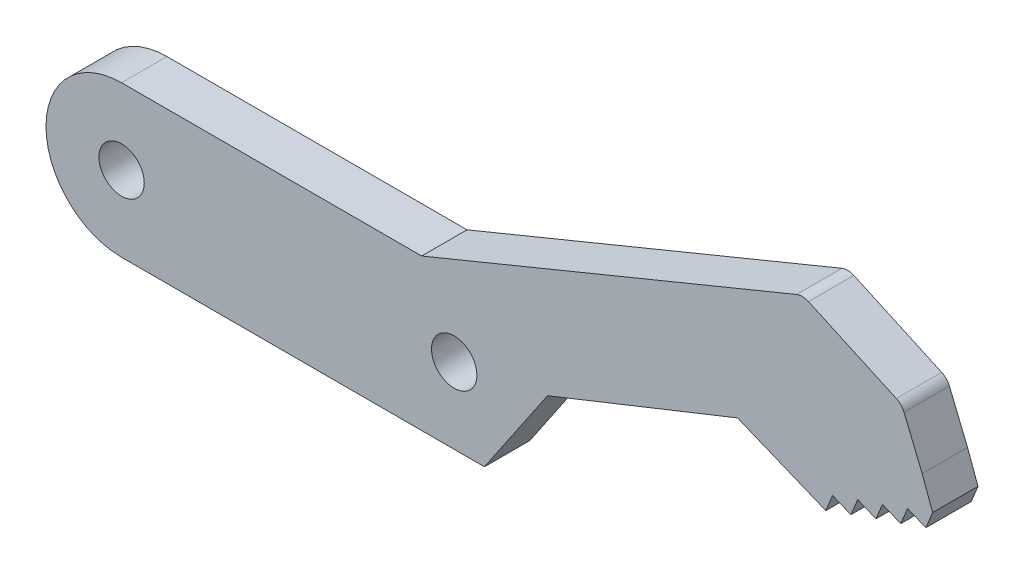
ISO-10303-21;
HEADER;
FILE_DESCRIPTION(('STEP AP214'),'2;1');
FILE_NAME('part.step','',(''),(''),'','','');
FILE_SCHEMA(('AUTOMOTIVE_DESIGN { 1 0 10303 214 1 1 1 1 }'));
ENDSEC;
DATA;
#1=APPLICATION_CONTEXT('core data for automotive mechanical design processes');
#2=APPLICATION_PROTOCOL_DEFINITION('international standard','automotive_design',2000,#1);
#3=PRODUCT_CONTEXT('',#1,'mechanical');
#4=PRODUCT('Part','Part','',(#3));
#5=PRODUCT_RELATED_PRODUCT_CATEGORY('part','',(#4));
#6=PRODUCT_DEFINITION_FORMATION('','',#4);
#7=PRODUCT_DEFINITION_CONTEXT('part definition',#1,'design');
#8=PRODUCT_DEFINITION('design','',#6,#7);
#9=PRODUCT_DEFINITION_SHAPE('','',#8);
#10=(LENGTH_UNIT() NAMED_UNIT(*) SI_UNIT(.MILLI.,.METRE.));
#11=(NAMED_UNIT(*) PLANE_ANGLE_UNIT() SI_UNIT($,.RADIAN.));
#12=(NAMED_UNIT(*) SI_UNIT($,.STERADIAN.) SOLID_ANGLE_UNIT());
#13=UNCERTAINTY_MEASURE_WITH_UNIT(LENGTH_MEASURE(1.E-05),#10,'distance_accuracy_value','');
#14=(GEOMETRIC_REPRESENTATION_CONTEXT(3) GLOBAL_UNCERTAINTY_ASSIGNED_CONTEXT((#13)) GLOBAL_UNIT_ASSIGNED_CONTEXT((#10,
#11,#12)) REPRESENTATION_CONTEXT('',''));
#15=CARTESIAN_POINT('',(0.,0.,0.));
#16=DIRECTION('',(0.,0.,1.));
#17=DIRECTION('',(1.,0.,0.));
#18=AXIS2_PLACEMENT_3D('',#15,#16,#17);
#19=CARTESIAN_POINT('',(0.,0.,3.));
#20=DIRECTION('',(0.,0.,1.));
#21=DIRECTION('',(1.,0.,0.));
#22=AXIS2_PLACEMENT_3D('',#19,#20,#21);
#23=PLANE('',#22);
#24=CARTESIAN_POINT('',(0.,0.,3.));
#25=DIRECTION('',(0.,0.,1.));
#26=DIRECTION('',(1.,0.,0.));
#27=AXIS2_PLACEMENT_3D('',#24,#25,#26);
#28=CIRCLE('',#27,1.5);
#29=CARTESIAN_POINT('',(1.5,0.,3.));
#30=VERTEX_POINT('',#29);
#31=EDGE_CURVE('E212',#30,#30,#28,.T.);
#32=ORIENTED_EDGE('',*,*,#31,.F.);
#33=EDGE_LOOP('',(#32));
#34=FACE_BOUND('',#33,.T.);
#35=CARTESIAN_POINT('',(0.,0.,3.));
#36=DIRECTION('',(0.,0.,1.));
#37=DIRECTION('',(1.,0.,0.));
#38=AXIS2_PLACEMENT_3D('',#35,#36,#37);
#39=CIRCLE('',#38,4.99999999999999);
#40=CARTESIAN_POINT('',(0.,4.99999999999997,3.));
#41=VERTEX_POINT('',#40);
#42=CARTESIAN_POINT('',(0.,-5.,3.));
#43=VERTEX_POINT('',#42);
#44=EDGE_CURVE('E249',#41,#43,#39,.T.);
#45=ORIENTED_EDGE('',*,*,#44,.T.);
#46=DIRECTION('',(1.,0.,0.));
#47=VECTOR('',#46,1.);
#48=CARTESIAN_POINT('',(0.,-5.,3.));
#49=LINE('',#48,#47);
#50=CARTESIAN_POINT('',(24.,-5.,3.));
#51=VERTEX_POINT('',#50);
#52=EDGE_CURVE('E132',#43,#51,#49,.T.);
#53=ORIENTED_EDGE('',*,*,#52,.T.);
#54=DIRECTION('',(0.561072489069584,0.82776667123608,0.));
#55=VECTOR('',#54,1.);
#56=CARTESIAN_POINT('',(24.,-5.,3.));
#57=LINE('',#56,#55);
#58=CARTESIAN_POINT('',(28.1743793186777,1.15858403399644,3.));
#59=VERTEX_POINT('',#58);
#60=EDGE_CURVE('E303',#51,#59,#57,.T.);
#61=ORIENTED_EDGE('',*,*,#60,.T.);
#62=DIRECTION('',(0.928874213198543,0.370395324018525,0.));
#63=VECTOR('',#62,1.);
#64=CARTESIAN_POINT('',(28.1743793186777,1.15858403399644,3.));
#65=LINE('',#64,#63);
#66=CARTESIAN_POINT('',(40.742047423254,6.17003276796709,3.));
#67=VERTEX_POINT('',#66);
#68=EDGE_CURVE('E322',#59,#67,#65,.T.);
#69=ORIENTED_EDGE('',*,*,#68,.T.);
#70=DIRECTION('',(0.925474403270302,-0.378810148876028,0.));
#71=VECTOR('',#70,1.);
#72=CARTESIAN_POINT('',(40.742047423254,6.17003276796709,3.));
#73=LINE('',#72,#71);
#74=CARTESIAN_POINT('',(46.5817909078896,3.77974072855935,3.));
#75=VERTEX_POINT('',#74);
#76=EDGE_CURVE('E319',#67,#75,#73,.T.);
#77=ORIENTED_EDGE('',*,*,#76,.T.);
#78=DIRECTION('',(0.378810148876023,0.925474403270304,0.));
#79=VECTOR('',#78,1.);
#80=CARTESIAN_POINT('',(46.5817909078896,3.77974072855935,3.));
#81=LINE('',#80,#79);
#82=CARTESIAN_POINT('',(47.0287868835633,4.87180052441831,3.));
#83=VERTEX_POINT('',#82);
#84=EDGE_CURVE('E321',#75,#83,#81,.T.);
#85=ORIENTED_EDGE('',*,*,#84,.T.);
#86=DIRECTION('',(0.925474403270304,-0.378810148876023,0.));
#87=VECTOR('',#86,1.);
#88=CARTESIAN_POINT('',(47.0287868835633,4.87180052441831,3.));
#89=LINE('',#88,#87);
#90=CARTESIAN_POINT('',(48.2417909078896,4.37530031499215,3.));
#91=VERTEX_POINT('',#90);
#92=EDGE_CURVE('E324',#83,#91,#89,.T.);
#93=ORIENTED_EDGE('',*,*,#92,.T.);
#94=DIRECTION('',(0.378810148876017,0.925474403270306,0.));
#95=VECTOR('',#94,1.);
#96=CARTESIAN_POINT('',(48.2417909078896,4.37530031499215,3.));
#97=LINE('',#96,#95);
#98=CARTESIAN_POINT('',(48.6887868835633,5.46736011085111,3.));
#99=VERTEX_POINT('',#98);
#100=EDGE_CURVE('E330',#91,#99,#97,.T.);
#101=ORIENTED_EDGE('',*,*,#100,.T.);
#102=DIRECTION('',(0.925474403270303,-0.378810148876025,0.));
#103=VECTOR('',#102,1.);
#104=CARTESIAN_POINT('',(48.6887868835633,5.46736011085111,3.));
#105=LINE('',#104,#103);
#106=CARTESIAN_POINT('',(49.9017909078896,4.97085990142494,3.));
#107=VERTEX_POINT('',#106);
#108=EDGE_CURVE('E332',#99,#107,#105,.T.);
#109=ORIENTED_EDGE('',*,*,#108,.T.);
#110=DIRECTION('',(0.378810148876031,0.925474403270301,0.));
#111=VECTOR('',#110,1.);
#112=CARTESIAN_POINT('',(49.9017909078896,4.97085990142494,3.));
#113=LINE('',#112,#111);
#114=CARTESIAN_POINT('',(50.3274137382742,6.01070277822532,3.));
#115=VERTEX_POINT('',#114);
#116=EDGE_CURVE('E334',#107,#115,#113,.T.);
#117=ORIENTED_EDGE('',*,*,#116,.T.);
#118=DIRECTION('',(0.925474403270304,-0.378810148876022,0.));
#119=VECTOR('',#118,1.);
#120=CARTESIAN_POINT('',(50.3274137382742,6.01070277822532,3.));
#121=LINE('',#120,#119);
#122=CARTESIAN_POINT('',(51.5404177626005,5.51420256879916,3.));
#123=VERTEX_POINT('',#122);
#124=EDGE_CURVE('E336',#115,#123,#121,.T.);
#125=ORIENTED_EDGE('',*,*,#124,.T.);
#126=DIRECTION('',(0.378810148876026,0.925474403270303,0.));
#127=VECTOR('',#126,1.);
#128=CARTESIAN_POINT('',(51.5404177626005,5.51420256879916,3.));
#129=LINE('',#128,#127);
#130=CARTESIAN_POINT('',(51.9874137382742,6.60626236465809,3.));
#131=VERTEX_POINT('',#130);
#132=EDGE_CURVE('E338',#123,#131,#129,.T.);
#133=ORIENTED_EDGE('',*,*,#132,.T.);
#134=DIRECTION('',(0.92547440327031,-0.378810148876008,0.));
#135=VECTOR('',#134,1.);
#136=CARTESIAN_POINT('',(51.9874137382742,6.60626236465809,3.));
#137=LINE('',#136,#135);
#138=CARTESIAN_POINT('',(53.2004177626005,6.10976215523195,3.));
#139=VERTEX_POINT('',#138);
#140=EDGE_CURVE('E340',#131,#139,#137,.T.);
#141=ORIENTED_EDGE('',*,*,#140,.T.);
#142=DIRECTION('',(0.378810148876011,0.925474403270309,0.));
#143=VECTOR('',#142,1.);
#144=CARTESIAN_POINT('',(53.2004177626005,6.10976215523195,3.));
#145=LINE('',#144,#143);
#146=CARTESIAN_POINT('',(53.6474137382742,7.20182195109092,3.));
#147=VERTEX_POINT('',#146);
#148=EDGE_CURVE('E342',#139,#147,#145,.T.);
#149=ORIENTED_EDGE('',*,*,#148,.T.);
#150=DIRECTION('',(-0.344909177439862,0.938636063294906,0.));
#151=VECTOR('',#150,1.);
#152=CARTESIAN_POINT('',(53.6474137382742,7.20182195109092,3.));
#153=LINE('',#152,#151);
#154=CARTESIAN_POINT('',(52.954960556224,9.08626449808284,3.));
#155=VERTEX_POINT('',#154);
#156=EDGE_CURVE('E344',#147,#155,#153,.T.);
#157=ORIENTED_EDGE('',*,*,#156,.T.);
#158=DIRECTION('',(-0.380263412733203,0.924878228166551,0.));
#159=VECTOR('',#158,1.);
#160=CARTESIAN_POINT('',(51.7554288533698,12.0037704132359,3.));
#161=LINE('',#160,#159);
#162=CARTESIAN_POINT('',(51.7554288533698,12.0037704132359,3.));
#163=VERTEX_POINT('',#162);
#164=EDGE_CURVE('E346',#155,#163,#161,.T.);
#165=ORIENTED_EDGE('',*,*,#164,.T.);
#166=CARTESIAN_POINT('',(50.8305506252032,11.6235070005027,3.));
#167=DIRECTION('',(0.,0.,1.));
#168=DIRECTION('',(-1.,0.,0.));
#169=AXIS2_PLACEMENT_3D('',#166,#167,#168);
#170=CIRCLE('',#169,1.);
#171=CARTESIAN_POINT('',(51.2450850433417,12.5335406351441,3.));
#172=VERTEX_POINT('',#171);
#173=EDGE_CURVE('E348',#163,#172,#170,.T.);
#174=ORIENTED_EDGE('',*,*,#173,.T.);
#175=DIRECTION('',(-0.910033634641374,0.414534418138482,0.));
#176=VECTOR('',#175,1.);
#177=CARTESIAN_POINT('',(45.4378668595606,15.1788184789301,3.));
#178=LINE('',#177,#176);
#179=CARTESIAN_POINT('',(45.4378668595606,15.1788184789301,3.));
#180=VERTEX_POINT('',#179);
#181=EDGE_CURVE('E190',#172,#180,#178,.T.);
#182=ORIENTED_EDGE('',*,*,#181,.T.);
#183=CARTESIAN_POINT('',(45.0233324414221,14.2687848442887,3.));
#184=DIRECTION('',(0.,0.,1.));
#185=DIRECTION('',(-1.,0.,0.));
#186=AXIS2_PLACEMENT_3D('',#183,#184,#185);
#187=CIRCLE('',#186,1.);
#188=CARTESIAN_POINT('',(44.6430690286889,15.1936630724553,3.));
#189=VERTEX_POINT('',#188);
#190=EDGE_CURVE('E184',#180,#189,#187,.T.);
#191=ORIENTED_EDGE('',*,*,#190,.T.);
#192=DIRECTION('',(-0.924878228166549,-0.380263412733206,0.));
#193=VECTOR('',#192,1.);
#194=CARTESIAN_POINT('',(19.85,5.,3.));
#195=LINE('',#194,#193);
#196=CARTESIAN_POINT('',(19.85,5.,3.));
#197=VERTEX_POINT('',#196);
#198=EDGE_CURVE('E188',#189,#197,#195,.T.);
#199=ORIENTED_EDGE('',*,*,#198,.T.);
#200=DIRECTION('',(-1.,0.,0.));
#201=VECTOR('',#200,1.);
#202=CARTESIAN_POINT('',(0.,4.99999999999997,3.));
#203=LINE('',#202,#201);
#204=EDGE_CURVE('E50',#197,#41,#203,.T.);
#205=ORIENTED_EDGE('',*,*,#204,.T.);
#206=EDGE_LOOP('',(#45,#53,#61,#69,#77,#85,#93,#101,#109,#117,#125,#133,#141,#149,#157,#165,
#174,#182,#191,#199,#205));
#207=FACE_BOUND('',#206,.T.);
#208=CARTESIAN_POINT('',(22.,0.,3.));
#209=DIRECTION('',(0.,0.,1.));
#210=DIRECTION('',(1.,0.,0.));
#211=AXIS2_PLACEMENT_3D('',#208,#209,#210);
#212=CIRCLE('',#211,1.5);
#213=CARTESIAN_POINT('',(23.5,0.,3.));
#214=VERTEX_POINT('',#213);
#215=EDGE_CURVE('E390',#214,#214,#212,.T.);
#216=ORIENTED_EDGE('',*,*,#215,.F.);
#217=EDGE_LOOP('',(#216));
#218=FACE_BOUND('',#217,.T.);
#219=ADVANCED_FACE('F33',(#34,#207,#218),#23,.T.);
#220=CARTESIAN_POINT('',(0.,0.,0.));
#221=DIRECTION('',(0.,0.,1.));
#222=DIRECTION('',(1.,0.,0.));
#223=AXIS2_PLACEMENT_3D('',#220,#221,#222);
#224=PLANE('',#223);
#225=CARTESIAN_POINT('',(0.,0.,0.));
#226=DIRECTION('',(0.,0.,1.));
#227=DIRECTION('',(1.,0.,0.));
#228=AXIS2_PLACEMENT_3D('',#225,#226,#227);
#229=CIRCLE('',#228,4.99999999999999);
#230=CARTESIAN_POINT('',(0.,4.99999999999997,0.));
#231=VERTEX_POINT('',#230);
#232=CARTESIAN_POINT('',(0.,-5.,0.));
#233=VERTEX_POINT('',#232);
#234=EDGE_CURVE('E208',#231,#233,#229,.T.);
#235=ORIENTED_EDGE('',*,*,#234,.F.);
#236=DIRECTION('',(-1.,0.,0.));
#237=VECTOR('',#236,1.);
#238=CARTESIAN_POINT('',(0.,4.99999999999997,0.));
#239=LINE('',#238,#237);
#240=CARTESIAN_POINT('',(19.85,5.,0.));
#241=VERTEX_POINT('',#240);
#242=EDGE_CURVE('E124',#241,#231,#239,.T.);
#243=ORIENTED_EDGE('',*,*,#242,.F.);
#244=DIRECTION('',(-0.924878228166549,-0.380263412733206,0.));
#245=VECTOR('',#244,1.);
#246=CARTESIAN_POINT('',(19.85,5.,0.));
#247=LINE('',#246,#245);
#248=CARTESIAN_POINT('',(44.6430690286889,15.1936630724553,0.));
#249=VERTEX_POINT('',#248);
#250=EDGE_CURVE('E118',#249,#241,#247,.T.);
#251=ORIENTED_EDGE('',*,*,#250,.F.);
#252=CARTESIAN_POINT('',(45.0233324414221,14.2687848442887,0.));
#253=DIRECTION('',(0.,0.,1.));
#254=DIRECTION('',(-1.,0.,0.));
#255=AXIS2_PLACEMENT_3D('',#252,#253,#254);
#256=CIRCLE('',#255,1.);
#257=CARTESIAN_POINT('',(45.4378668595606,15.1788184789301,0.));
#258=VERTEX_POINT('',#257);
#259=EDGE_CURVE('E198',#258,#249,#256,.T.);
#260=ORIENTED_EDGE('',*,*,#259,.F.);
#261=DIRECTION('',(-0.910033634641374,0.414534418138482,0.));
#262=VECTOR('',#261,1.);
#263=CARTESIAN_POINT('',(45.4378668595606,15.1788184789301,0.));
#264=LINE('',#263,#262);
#265=CARTESIAN_POINT('',(51.2450850433417,12.5335406351441,0.));
#266=VERTEX_POINT('',#265);
#267=EDGE_CURVE('E244',#266,#258,#264,.T.);
#268=ORIENTED_EDGE('',*,*,#267,.F.);
#269=CARTESIAN_POINT('',(50.8305506252032,11.6235070005027,0.));
#270=DIRECTION('',(0.,0.,1.));
#271=DIRECTION('',(-1.,0.,0.));
#272=AXIS2_PLACEMENT_3D('',#269,#270,#271);
#273=CIRCLE('',#272,1.);
#274=CARTESIAN_POINT('',(51.7554288533698,12.0037704132359,0.));
#275=VERTEX_POINT('',#274);
#276=EDGE_CURVE('E242',#275,#266,#273,.T.);
#277=ORIENTED_EDGE('',*,*,#276,.F.);
#278=DIRECTION('',(-0.380263412733203,0.924878228166551,0.));
#279=VECTOR('',#278,1.);
#280=CARTESIAN_POINT('',(51.7554288533698,12.0037704132359,0.));
#281=LINE('',#280,#279);
#282=CARTESIAN_POINT('',(52.954960556224,9.08626449808284,0.));
#283=VERTEX_POINT('',#282);
#284=EDGE_CURVE('E240',#283,#275,#281,.T.);
#285=ORIENTED_EDGE('',*,*,#284,.F.);
#286=DIRECTION('',(-0.344909177439862,0.938636063294906,0.));
#287=VECTOR('',#286,1.);
#288=CARTESIAN_POINT('',(53.6474137382742,7.20182195109092,0.));
#289=LINE('',#288,#287);
#290=CARTESIAN_POINT('',(53.6474137382742,7.20182195109092,0.));
#291=VERTEX_POINT('',#290);
#292=EDGE_CURVE('E238',#291,#283,#289,.T.);
#293=ORIENTED_EDGE('',*,*,#292,.F.);
#294=DIRECTION('',(0.378810148876011,0.925474403270309,0.));
#295=VECTOR('',#294,1.);
#296=CARTESIAN_POINT('',(53.2004177626005,6.10976215523195,0.));
#297=LINE('',#296,#295);
#298=CARTESIAN_POINT('',(53.2004177626005,6.10976215523195,0.));
#299=VERTEX_POINT('',#298);
#300=EDGE_CURVE('E236',#299,#291,#297,.T.);
#301=ORIENTED_EDGE('',*,*,#300,.F.);
#302=DIRECTION('',(0.92547440327031,-0.378810148876008,0.));
#303=VECTOR('',#302,1.);
#304=CARTESIAN_POINT('',(51.9874137382742,6.60626236465809,0.));
#305=LINE('',#304,#303);
#306=CARTESIAN_POINT('',(51.9874137382742,6.60626236465809,0.));
#307=VERTEX_POINT('',#306);
#308=EDGE_CURVE('E234',#307,#299,#305,.T.);
#309=ORIENTED_EDGE('',*,*,#308,.F.);
#310=DIRECTION('',(0.378810148876026,0.925474403270303,0.));
#311=VECTOR('',#310,1.);
#312=CARTESIAN_POINT('',(51.5404177626005,5.51420256879916,0.));
#313=LINE('',#312,#311);
#314=CARTESIAN_POINT('',(51.5404177626005,5.51420256879916,0.));
#315=VERTEX_POINT('',#314);
#316=EDGE_CURVE('E232',#315,#307,#313,.T.);
#317=ORIENTED_EDGE('',*,*,#316,.F.);
#318=DIRECTION('',(0.925474403270304,-0.378810148876022,0.));
#319=VECTOR('',#318,1.);
#320=CARTESIAN_POINT('',(50.3274137382742,6.01070277822532,0.));
#321=LINE('',#320,#319);
#322=CARTESIAN_POINT('',(50.3274137382742,6.01070277822532,0.));
#323=VERTEX_POINT('',#322);
#324=EDGE_CURVE('E230',#323,#315,#321,.T.);
#325=ORIENTED_EDGE('',*,*,#324,.F.);
#326=DIRECTION('',(0.378810148876031,0.925474403270301,0.));
#327=VECTOR('',#326,1.);
#328=CARTESIAN_POINT('',(49.9017909078896,4.97085990142494,0.));
#329=LINE('',#328,#327);
#330=CARTESIAN_POINT('',(49.9017909078896,4.97085990142494,0.));
#331=VERTEX_POINT('',#330);
#332=EDGE_CURVE('E228',#331,#323,#329,.T.);
#333=ORIENTED_EDGE('',*,*,#332,.F.);
#334=DIRECTION('',(0.925474403270303,-0.378810148876025,0.));
#335=VECTOR('',#334,1.);
#336=CARTESIAN_POINT('',(48.6887868835633,5.46736011085111,0.));
#337=LINE('',#336,#335);
#338=CARTESIAN_POINT('',(48.6887868835633,5.46736011085111,0.));
#339=VERTEX_POINT('',#338);
#340=EDGE_CURVE('E226',#339,#331,#337,.T.);
#341=ORIENTED_EDGE('',*,*,#340,.F.);
#342=DIRECTION('',(0.378810148876017,0.925474403270306,0.));
#343=VECTOR('',#342,1.);
#344=CARTESIAN_POINT('',(48.2417909078896,4.37530031499215,0.));
#345=LINE('',#344,#343);
#346=CARTESIAN_POINT('',(48.2417909078896,4.37530031499215,0.));
#347=VERTEX_POINT('',#346);
#348=EDGE_CURVE('E224',#347,#339,#345,.T.);
#349=ORIENTED_EDGE('',*,*,#348,.F.);
#350=DIRECTION('',(0.925474403270304,-0.378810148876023,0.));
#351=VECTOR('',#350,1.);
#352=CARTESIAN_POINT('',(47.0287868835633,4.87180052441831,0.));
#353=LINE('',#352,#351);
#354=CARTESIAN_POINT('',(47.0287868835633,4.87180052441831,0.));
#355=VERTEX_POINT('',#354);
#356=EDGE_CURVE('E222',#355,#347,#353,.T.);
#357=ORIENTED_EDGE('',*,*,#356,.F.);
#358=DIRECTION('',(0.378810148876023,0.925474403270304,0.));
#359=VECTOR('',#358,1.);
#360=CARTESIAN_POINT('',(46.5817909078896,3.77974072855935,0.));
#361=LINE('',#360,#359);
#362=CARTESIAN_POINT('',(46.5817909078896,3.77974072855935,0.));
#363=VERTEX_POINT('',#362);
#364=EDGE_CURVE('E220',#363,#355,#361,.T.);
#365=ORIENTED_EDGE('',*,*,#364,.F.);
#366=DIRECTION('',(0.925474403270302,-0.378810148876028,0.));
#367=VECTOR('',#366,1.);
#368=CARTESIAN_POINT('',(40.742047423254,6.17003276796709,0.));
#369=LINE('',#368,#367);
#370=CARTESIAN_POINT('',(40.742047423254,6.17003276796709,0.));
#371=VERTEX_POINT('',#370);
#372=EDGE_CURVE('E218',#371,#363,#369,.T.);
#373=ORIENTED_EDGE('',*,*,#372,.F.);
#374=DIRECTION('',(0.928874213198543,0.370395324018525,0.));
#375=VECTOR('',#374,1.);
#376=CARTESIAN_POINT('',(28.1743793186777,1.15858403399644,0.));
#377=LINE('',#376,#375);
#378=CARTESIAN_POINT('',(28.1743793186777,1.15858403399644,0.));
#379=VERTEX_POINT('',#378);
#380=EDGE_CURVE('E216',#379,#371,#377,.T.);
#381=ORIENTED_EDGE('',*,*,#380,.F.);
#382=DIRECTION('',(0.561072489069584,0.82776667123608,0.));
#383=VECTOR('',#382,1.);
#384=CARTESIAN_POINT('',(24.,-5.,0.));
#385=LINE('',#384,#383);
#386=CARTESIAN_POINT('',(24.,-5.,0.));
#387=VERTEX_POINT('',#386);
#388=EDGE_CURVE('E214',#387,#379,#385,.T.);
#389=ORIENTED_EDGE('',*,*,#388,.F.);
#390=DIRECTION('',(1.,0.,0.));
#391=VECTOR('',#390,1.);
#392=CARTESIAN_POINT('',(24.,-5.,0.));
#393=LINE('',#392,#391);
#394=EDGE_CURVE('E211',#233,#387,#393,.T.);
#395=ORIENTED_EDGE('',*,*,#394,.F.);
#396=EDGE_LOOP('',(#235,#243,#251,#260,#268,#277,#285,#293,#301,#309,#317,#325,#333,#341,#349,
#357,#365,#373,#381,#389,#395));
#397=FACE_BOUND('',#396,.T.);
#398=CARTESIAN_POINT('',(0.,0.,0.));
#399=DIRECTION('',(0.,0.,1.));
#400=DIRECTION('',(1.,0.,0.));
#401=AXIS2_PLACEMENT_3D('',#398,#399,#400);
#402=CIRCLE('',#401,1.5);
#403=CARTESIAN_POINT('',(1.5,0.,0.));
#404=VERTEX_POINT('',#403);
#405=EDGE_CURVE('E396',#404,#404,#402,.T.);
#406=ORIENTED_EDGE('',*,*,#405,.T.);
#407=EDGE_LOOP('',(#406));
#408=FACE_BOUND('',#407,.T.);
#409=CARTESIAN_POINT('',(22.,0.,0.));
#410=DIRECTION('',(0.,0.,1.));
#411=DIRECTION('',(1.,0.,0.));
#412=AXIS2_PLACEMENT_3D('',#409,#410,#411);
#413=CIRCLE('',#412,1.5);
#414=CARTESIAN_POINT('',(23.5,0.,0.));
#415=VERTEX_POINT('',#414);
#416=EDGE_CURVE('E393',#415,#415,#413,.T.);
#417=ORIENTED_EDGE('',*,*,#416,.T.);
#418=EDGE_LOOP('',(#417));
#419=FACE_BOUND('',#418,.T.);
#420=ADVANCED_FACE('F307',(#397,#408,#419),#224,.F.);
#421=CARTESIAN_POINT('',(0.,0.,3.));
#422=DIRECTION('',(0.,0.,-1.));
#423=DIRECTION('',(-1.,0.,0.));
#424=AXIS2_PLACEMENT_3D('',#421,#422,#423);
#425=CYLINDRICAL_SURFACE('',#424,4.99999999999999);
#426=ORIENTED_EDGE('',*,*,#234,.T.);
#427=DIRECTION('',(0.,0.,-1.));
#428=VECTOR('',#427,1.);
#429=CARTESIAN_POINT('',(0.,-5.,3.));
#430=LINE('',#429,#428);
#431=EDGE_CURVE('E11',#43,#233,#430,.T.);
#432=ORIENTED_EDGE('',*,*,#431,.F.);
#433=ORIENTED_EDGE('',*,*,#44,.F.);
#434=DIRECTION('',(0.,0.,-1.));
#435=VECTOR('',#434,1.);
#436=CARTESIAN_POINT('',(0.,4.99999999999997,3.));
#437=LINE('',#436,#435);
#438=EDGE_CURVE('E204',#41,#231,#437,.T.);
#439=ORIENTED_EDGE('',*,*,#438,.T.);
#440=EDGE_LOOP('',(#426,#432,#433,#439));
#441=FACE_BOUND('',#440,.T.);
#442=ADVANCED_FACE('F35',(#441),#425,.T.);
#443=CARTESIAN_POINT('',(24.,-5.,3.));
#444=DIRECTION('',(0.,1.,0.));
#445=DIRECTION('',(-1.,0.,0.));
#446=AXIS2_PLACEMENT_3D('',#443,#444,#445);
#447=PLANE('',#446);
#448=ORIENTED_EDGE('',*,*,#394,.T.);
#449=DIRECTION('',(0.,0.,-1.));
#450=VECTOR('',#449,1.);
#451=CARTESIAN_POINT('',(24.,-5.,3.));
#452=LINE('',#451,#450);
#453=EDGE_CURVE('E42',#51,#387,#452,.T.);
#454=ORIENTED_EDGE('',*,*,#453,.F.);
#455=ORIENTED_EDGE('',*,*,#52,.F.);
#456=ORIENTED_EDGE('',*,*,#431,.T.);
#457=EDGE_LOOP('',(#448,#454,#455,#456));
#458=FACE_BOUND('',#457,.T.);
#459=ADVANCED_FACE('F579',(#458),#447,.F.);
#460=CARTESIAN_POINT('',(24.,-5.,3.));
#461=DIRECTION('',(-0.82776667123608,0.561072489069584,0.));
#462=DIRECTION('',(-0.561072489069584,-0.82776667123608,0.));
#463=AXIS2_PLACEMENT_3D('',#460,#461,#462);
#464=PLANE('',#463);
#465=ORIENTED_EDGE('',*,*,#388,.T.);
#466=DIRECTION('',(0.,0.,-1.));
#467=VECTOR('',#466,1.);
#468=CARTESIAN_POINT('',(28.1743793186777,1.15858403399644,3.));
#469=LINE('',#468,#467);
#470=EDGE_CURVE('E295',#59,#379,#469,.T.);
#471=ORIENTED_EDGE('',*,*,#470,.F.);
#472=ORIENTED_EDGE('',*,*,#60,.F.);
#473=ORIENTED_EDGE('',*,*,#453,.T.);
#474=EDGE_LOOP('',(#465,#471,#472,#473));
#475=FACE_BOUND('',#474,.T.);
#476=ADVANCED_FACE('F301',(#475),#464,.F.);
#477=CARTESIAN_POINT('',(28.1743793186777,1.15858403399644,3.));
#478=DIRECTION('',(-0.370395324018525,0.928874213198543,0.));
#479=DIRECTION('',(-0.928874213198543,-0.370395324018525,0.));
#480=AXIS2_PLACEMENT_3D('',#477,#478,#479);
#481=PLANE('',#480);
#482=ORIENTED_EDGE('',*,*,#380,.T.);
#483=DIRECTION('',(0.,0.,-1.));
#484=VECTOR('',#483,1.);
#485=CARTESIAN_POINT('',(40.742047423254,6.17003276796709,3.));
#486=LINE('',#485,#484);
#487=EDGE_CURVE('E292',#67,#371,#486,.T.);
#488=ORIENTED_EDGE('',*,*,#487,.F.);
#489=ORIENTED_EDGE('',*,*,#68,.F.);
#490=ORIENTED_EDGE('',*,*,#470,.T.);
#491=EDGE_LOOP('',(#482,#488,#489,#490));
#492=FACE_BOUND('',#491,.T.);
#493=ADVANCED_FACE('F313',(#492),#481,.F.);
#494=CARTESIAN_POINT('',(40.742047423254,6.17003276796709,3.));
#495=DIRECTION('',(0.378810148876028,0.925474403270302,0.));
#496=DIRECTION('',(-0.925474403270302,0.378810148876028,0.));
#497=AXIS2_PLACEMENT_3D('',#494,#495,#496);
#498=PLANE('',#497);
#499=ORIENTED_EDGE('',*,*,#372,.T.);
#500=DIRECTION('',(0.,0.,-1.));
#501=VECTOR('',#500,1.);
#502=CARTESIAN_POINT('',(46.5817909078896,3.77974072855935,3.));
#503=LINE('',#502,#501);
#504=EDGE_CURVE('E289',#75,#363,#503,.T.);
#505=ORIENTED_EDGE('',*,*,#504,.F.);
#506=ORIENTED_EDGE('',*,*,#76,.F.);
#507=ORIENTED_EDGE('',*,*,#487,.T.);
#508=EDGE_LOOP('',(#499,#505,#506,#507));
#509=FACE_BOUND('',#508,.T.);
#510=ADVANCED_FACE('F317',(#509),#498,.F.);
#511=CARTESIAN_POINT('',(46.5817909078896,3.77974072855935,3.));
#512=DIRECTION('',(-0.925474403270304,0.378810148876023,0.));
#513=DIRECTION('',(-0.378810148876023,-0.925474403270304,0.));
#514=AXIS2_PLACEMENT_3D('',#511,#512,#513);
#515=PLANE('',#514);
#516=ORIENTED_EDGE('',*,*,#364,.T.);
#517=DIRECTION('',(0.,0.,-1.));
#518=VECTOR('',#517,1.);
#519=CARTESIAN_POINT('',(47.0287868835633,4.87180052441831,3.));
#520=LINE('',#519,#518);
#521=EDGE_CURVE('E286',#83,#355,#520,.T.);
#522=ORIENTED_EDGE('',*,*,#521,.F.);
#523=ORIENTED_EDGE('',*,*,#84,.F.);
#524=ORIENTED_EDGE('',*,*,#504,.T.);
#525=EDGE_LOOP('',(#516,#522,#523,#524));
#526=FACE_BOUND('',#525,.T.);
#527=ADVANCED_FACE('F544',(#526),#515,.F.);
#528=CARTESIAN_POINT('',(47.0287868835633,4.87180052441831,3.));
#529=DIRECTION('',(0.378810148876023,0.925474403270304,0.));
#530=DIRECTION('',(-0.925474403270304,0.378810148876023,0.));
#531=AXIS2_PLACEMENT_3D('',#528,#529,#530);
#532=PLANE('',#531);
#533=ORIENTED_EDGE('',*,*,#356,.T.);
#534=DIRECTION('',(0.,0.,-1.));
#535=VECTOR('',#534,1.);
#536=CARTESIAN_POINT('',(48.2417909078896,4.37530031499215,3.));
#537=LINE('',#536,#535);
#538=EDGE_CURVE('E283',#91,#347,#537,.T.);
#539=ORIENTED_EDGE('',*,*,#538,.F.);
#540=ORIENTED_EDGE('',*,*,#92,.F.);
#541=ORIENTED_EDGE('',*,*,#521,.T.);
#542=EDGE_LOOP('',(#533,#539,#540,#541));
#543=FACE_BOUND('',#542,.T.);
#544=ADVANCED_FACE('F534',(#543),#532,.F.);
#545=CARTESIAN_POINT('',(48.2417909078896,4.37530031499215,3.));
#546=DIRECTION('',(-0.925474403270306,0.378810148876017,0.));
#547=DIRECTION('',(-0.378810148876017,-0.925474403270307,0.));
#548=AXIS2_PLACEMENT_3D('',#545,#546,#547);
#549=PLANE('',#548);
#550=ORIENTED_EDGE('',*,*,#348,.T.);
#551=DIRECTION('',(0.,0.,-1.));
#552=VECTOR('',#551,1.);
#553=CARTESIAN_POINT('',(48.6887868835633,5.46736011085111,3.));
#554=LINE('',#553,#552);
#555=EDGE_CURVE('E280',#99,#339,#554,.T.);
#556=ORIENTED_EDGE('',*,*,#555,.F.);
#557=ORIENTED_EDGE('',*,*,#100,.F.);
#558=ORIENTED_EDGE('',*,*,#538,.T.);
#559=EDGE_LOOP('',(#550,#556,#557,#558));
#560=FACE_BOUND('',#559,.T.);
#561=ADVANCED_FACE('F524',(#560),#549,.F.);
#562=CARTESIAN_POINT('',(48.6887868835633,5.46736011085111,3.));
#563=DIRECTION('',(0.378810148876025,0.925474403270303,0.));
#564=DIRECTION('',(-0.925474403270303,0.378810148876025,0.));
#565=AXIS2_PLACEMENT_3D('',#562,#563,#564);
#566=PLANE('',#565);
#567=ORIENTED_EDGE('',*,*,#340,.T.);
#568=DIRECTION('',(0.,0.,-1.));
#569=VECTOR('',#568,1.);
#570=CARTESIAN_POINT('',(49.9017909078896,4.97085990142494,3.));
#571=LINE('',#570,#569);
#572=EDGE_CURVE('E277',#107,#331,#571,.T.);
#573=ORIENTED_EDGE('',*,*,#572,.F.);
#574=ORIENTED_EDGE('',*,*,#108,.F.);
#575=ORIENTED_EDGE('',*,*,#555,.T.);
#576=EDGE_LOOP('',(#567,#573,#574,#575));
#577=FACE_BOUND('',#576,.T.);
#578=ADVANCED_FACE('F514',(#577),#566,.F.);
#579=CARTESIAN_POINT('',(49.9017909078896,4.97085990142494,3.));
#580=DIRECTION('',(-0.925474403270301,0.378810148876031,0.));
#581=DIRECTION('',(-0.378810148876031,-0.925474403270301,0.));
#582=AXIS2_PLACEMENT_3D('',#579,#580,#581);
#583=PLANE('',#582);
#584=ORIENTED_EDGE('',*,*,#332,.T.);
#585=DIRECTION('',(0.,0.,-1.));
#586=VECTOR('',#585,1.);
#587=CARTESIAN_POINT('',(50.3274137382742,6.01070277822532,3.));
#588=LINE('',#587,#586);
#589=EDGE_CURVE('E274',#115,#323,#588,.T.);
#590=ORIENTED_EDGE('',*,*,#589,.F.);
#591=ORIENTED_EDGE('',*,*,#116,.F.);
#592=ORIENTED_EDGE('',*,*,#572,.T.);
#593=EDGE_LOOP('',(#584,#590,#591,#592));
#594=FACE_BOUND('',#593,.T.);
#595=ADVANCED_FACE('F504',(#594),#583,.F.);
#596=CARTESIAN_POINT('',(50.3274137382742,6.01070277822532,3.));
#597=DIRECTION('',(0.378810148876022,0.925474403270304,0.));
#598=DIRECTION('',(-0.925474403270305,0.378810148876022,0.));
#599=AXIS2_PLACEMENT_3D('',#596,#597,#598);
#600=PLANE('',#599);
#601=ORIENTED_EDGE('',*,*,#324,.T.);
#602=DIRECTION('',(0.,0.,-1.));
#603=VECTOR('',#602,1.);
#604=CARTESIAN_POINT('',(51.5404177626005,5.51420256879916,3.));
#605=LINE('',#604,#603);
#606=EDGE_CURVE('E271',#123,#315,#605,.T.);
#607=ORIENTED_EDGE('',*,*,#606,.F.);
#608=ORIENTED_EDGE('',*,*,#124,.F.);
#609=ORIENTED_EDGE('',*,*,#589,.T.);
#610=EDGE_LOOP('',(#601,#607,#608,#609));
#611=FACE_BOUND('',#610,.T.);
#612=ADVANCED_FACE('F494',(#611),#600,.F.);
#613=CARTESIAN_POINT('',(51.5404177626005,5.51420256879916,3.));
#614=DIRECTION('',(-0.925474403270303,0.378810148876026,0.));
#615=DIRECTION('',(-0.378810148876026,-0.925474403270303,0.));
#616=AXIS2_PLACEMENT_3D('',#613,#614,#615);
#617=PLANE('',#616);
#618=ORIENTED_EDGE('',*,*,#316,.T.);
#619=DIRECTION('',(0.,0.,-1.));
#620=VECTOR('',#619,1.);
#621=CARTESIAN_POINT('',(51.9874137382742,6.60626236465809,3.));
#622=LINE('',#621,#620);
#623=EDGE_CURVE('E268',#131,#307,#622,.T.);
#624=ORIENTED_EDGE('',*,*,#623,.F.);
#625=ORIENTED_EDGE('',*,*,#132,.F.);
#626=ORIENTED_EDGE('',*,*,#606,.T.);
#627=EDGE_LOOP('',(#618,#624,#625,#626));
#628=FACE_BOUND('',#627,.T.);
#629=ADVANCED_FACE('F484',(#628),#617,.F.);
#630=CARTESIAN_POINT('',(51.9874137382742,6.60626236465809,3.));
#631=DIRECTION('',(0.378810148876008,0.92547440327031,0.));
#632=DIRECTION('',(-0.92547440327031,0.378810148876008,0.));
#633=AXIS2_PLACEMENT_3D('',#630,#631,#632);
#634=PLANE('',#633);
#635=ORIENTED_EDGE('',*,*,#308,.T.);
#636=DIRECTION('',(0.,0.,-1.));
#637=VECTOR('',#636,1.);
#638=CARTESIAN_POINT('',(53.2004177626005,6.10976215523195,3.));
#639=LINE('',#638,#637);
#640=EDGE_CURVE('E265',#139,#299,#639,.T.);
#641=ORIENTED_EDGE('',*,*,#640,.F.);
#642=ORIENTED_EDGE('',*,*,#140,.F.);
#643=ORIENTED_EDGE('',*,*,#623,.T.);
#644=EDGE_LOOP('',(#635,#641,#642,#643));
#645=FACE_BOUND('',#644,.T.);
#646=ADVANCED_FACE('F474',(#645),#634,.F.);
#647=CARTESIAN_POINT('',(53.2004177626005,6.10976215523195,3.));
#648=DIRECTION('',(-0.925474403270309,0.378810148876011,0.));
#649=DIRECTION('',(-0.378810148876011,-0.925474403270309,0.));
#650=AXIS2_PLACEMENT_3D('',#647,#648,#649);
#651=PLANE('',#650);
#652=ORIENTED_EDGE('',*,*,#300,.T.);
#653=DIRECTION('',(0.,0.,-1.));
#654=VECTOR('',#653,1.);
#655=CARTESIAN_POINT('',(53.6474137382742,7.20182195109092,3.));
#656=LINE('',#655,#654);
#657=EDGE_CURVE('E262',#147,#291,#656,.T.);
#658=ORIENTED_EDGE('',*,*,#657,.F.);
#659=ORIENTED_EDGE('',*,*,#148,.F.);
#660=ORIENTED_EDGE('',*,*,#640,.T.);
#661=EDGE_LOOP('',(#652,#658,#659,#660));
#662=FACE_BOUND('',#661,.T.);
#663=ADVANCED_FACE('F464',(#662),#651,.F.);
#664=CARTESIAN_POINT('',(53.6474137382742,7.20182195109092,3.));
#665=DIRECTION('',(-0.938636063294906,-0.344909177439862,0.));
#666=DIRECTION('',(0.344909177439862,-0.938636063294906,0.));
#667=AXIS2_PLACEMENT_3D('',#664,#665,#666);
#668=PLANE('',#667);
#669=ORIENTED_EDGE('',*,*,#292,.T.);
#670=DIRECTION('',(0.,0.,-1.));
#671=VECTOR('',#670,1.);
#672=CARTESIAN_POINT('',(52.954960556224,9.08626449808284,3.));
#673=LINE('',#672,#671);
#674=EDGE_CURVE('E259',#155,#283,#673,.T.);
#675=ORIENTED_EDGE('',*,*,#674,.F.);
#676=ORIENTED_EDGE('',*,*,#156,.F.);
#677=ORIENTED_EDGE('',*,*,#657,.T.);
#678=EDGE_LOOP('',(#669,#675,#676,#677));
#679=FACE_BOUND('',#678,.T.);
#680=ADVANCED_FACE('F454',(#679),#668,.F.);
#681=CARTESIAN_POINT('',(51.7554288533698,12.0037704132359,3.));
#682=DIRECTION('',(-0.924878228166551,-0.380263412733203,0.));
#683=DIRECTION('',(0.380263412733203,-0.924878228166551,0.));
#684=AXIS2_PLACEMENT_3D('',#681,#682,#683);
#685=PLANE('',#684);
#686=ORIENTED_EDGE('',*,*,#284,.T.);
#687=DIRECTION('',(0.,0.,-1.));
#688=VECTOR('',#687,1.);
#689=CARTESIAN_POINT('',(51.7554288533698,12.0037704132359,3.));
#690=LINE('',#689,#688);
#691=EDGE_CURVE('E256',#163,#275,#690,.T.);
#692=ORIENTED_EDGE('',*,*,#691,.F.);
#693=ORIENTED_EDGE('',*,*,#164,.F.);
#694=ORIENTED_EDGE('',*,*,#674,.T.);
#695=EDGE_LOOP('',(#686,#692,#693,#694));
#696=FACE_BOUND('',#695,.T.);
#697=ADVANCED_FACE('F445',(#696),#685,.F.);
#698=CARTESIAN_POINT('',(50.8305506252032,11.6235070005027,3.));
#699=DIRECTION('',(0.,0.,-1.));
#700=DIRECTION('',(-1.,0.,0.));
#701=AXIS2_PLACEMENT_3D('',#698,#699,#700);
#702=CYLINDRICAL_SURFACE('',#701,1.);
#703=ORIENTED_EDGE('',*,*,#276,.T.);
#704=DIRECTION('',(0.,0.,-1.));
#705=VECTOR('',#704,1.);
#706=CARTESIAN_POINT('',(51.2450850433417,12.5335406351441,3.));
#707=LINE('',#706,#705);
#708=EDGE_CURVE('E253',#172,#266,#707,.T.);
#709=ORIENTED_EDGE('',*,*,#708,.F.);
#710=ORIENTED_EDGE('',*,*,#173,.F.);
#711=ORIENTED_EDGE('',*,*,#691,.T.);
#712=EDGE_LOOP('',(#703,#709,#710,#711));
#713=FACE_BOUND('',#712,.T.);
#714=ADVANCED_FACE('F354',(#713),#702,.T.);
#715=CARTESIAN_POINT('',(45.4378668595606,15.1788184789301,3.));
#716=DIRECTION('',(-0.414534418138482,-0.910033634641374,0.));
#717=DIRECTION('',(0.910033634641374,-0.414534418138482,0.));
#718=AXIS2_PLACEMENT_3D('',#715,#716,#717);
#719=PLANE('',#718);
#720=ORIENTED_EDGE('',*,*,#267,.T.);
#721=DIRECTION('',(0.,0.,-1.));
#722=VECTOR('',#721,1.);
#723=CARTESIAN_POINT('',(45.4378668595606,15.1788184789301,3.));
#724=LINE('',#723,#722);
#725=EDGE_CURVE('E199',#180,#258,#724,.T.);
#726=ORIENTED_EDGE('',*,*,#725,.F.);
#727=ORIENTED_EDGE('',*,*,#181,.F.);
#728=ORIENTED_EDGE('',*,*,#708,.T.);
#729=EDGE_LOOP('',(#720,#726,#727,#728));
#730=FACE_BOUND('',#729,.T.);
#731=ADVANCED_FACE('F358',(#730),#719,.F.);
#732=CARTESIAN_POINT('',(45.0233324414221,14.2687848442887,3.));
#733=DIRECTION('',(0.,0.,-1.));
#734=DIRECTION('',(-1.,0.,0.));
#735=AXIS2_PLACEMENT_3D('',#732,#733,#734);
#736=CYLINDRICAL_SURFACE('',#735,1.);
#737=ORIENTED_EDGE('',*,*,#259,.T.);
#738=DIRECTION('',(0.,0.,-1.));
#739=VECTOR('',#738,1.);
#740=CARTESIAN_POINT('',(44.6430690286889,15.1936630724553,3.));
#741=LINE('',#740,#739);
#742=EDGE_CURVE('E195',#189,#249,#741,.T.);
#743=ORIENTED_EDGE('',*,*,#742,.F.);
#744=ORIENTED_EDGE('',*,*,#190,.F.);
#745=ORIENTED_EDGE('',*,*,#725,.T.);
#746=EDGE_LOOP('',(#737,#743,#744,#745));
#747=FACE_BOUND('',#746,.T.);
#748=ADVANCED_FACE('F196',(#747),#736,.T.);
#749=CARTESIAN_POINT('',(19.85,5.,3.));
#750=DIRECTION('',(0.380263412733207,-0.924878228166549,0.));
#751=DIRECTION('',(0.924878228166549,0.380263412733207,0.));
#752=AXIS2_PLACEMENT_3D('',#749,#750,#751);
#753=PLANE('',#752);
#754=ORIENTED_EDGE('',*,*,#250,.T.);
#755=DIRECTION('',(0.,0.,-1.));
#756=VECTOR('',#755,1.);
#757=CARTESIAN_POINT('',(19.85,5.,3.));
#758=LINE('',#757,#756);
#759=EDGE_CURVE('E200',#197,#241,#758,.T.);
#760=ORIENTED_EDGE('',*,*,#759,.F.);
#761=ORIENTED_EDGE('',*,*,#198,.F.);
#762=ORIENTED_EDGE('',*,*,#742,.T.);
#763=EDGE_LOOP('',(#754,#760,#761,#762));
#764=FACE_BOUND('',#763,.T.);
#765=ADVANCED_FACE('F202',(#764),#753,.F.);
#766=CARTESIAN_POINT('',(0.,4.99999999999997,3.));
#767=DIRECTION('',(0.,-1.,0.));
#768=DIRECTION('',(1.,0.,0.));
#769=AXIS2_PLACEMENT_3D('',#766,#767,#768);
#770=PLANE('',#769);
#771=ORIENTED_EDGE('',*,*,#242,.T.);
#772=ORIENTED_EDGE('',*,*,#438,.F.);
#773=ORIENTED_EDGE('',*,*,#204,.F.);
#774=ORIENTED_EDGE('',*,*,#759,.T.);
#775=EDGE_LOOP('',(#771,#772,#773,#774));
#776=FACE_BOUND('',#775,.T.);
#777=ADVANCED_FACE('F362',(#776),#770,.F.);
#778=CARTESIAN_POINT('',(0.,0.,3.));
#779=DIRECTION('',(0.,0.,-1.));
#780=DIRECTION('',(-1.,0.,0.));
#781=AXIS2_PLACEMENT_3D('',#778,#779,#780);
#782=CYLINDRICAL_SURFACE('',#781,1.5);
#783=ORIENTED_EDGE('',*,*,#31,.T.);
#784=EDGE_LOOP('',(#783));
#785=FACE_BOUND('',#784,.T.);
#786=ORIENTED_EDGE('',*,*,#405,.F.);
#787=EDGE_LOOP('',(#786));
#788=FACE_BOUND('',#787,.T.);
#789=ADVANCED_FACE('F364',(#785,#788),#782,.F.);
#790=CARTESIAN_POINT('',(22.,0.,3.));
#791=DIRECTION('',(0.,0.,-1.));
#792=DIRECTION('',(-1.,0.,0.));
#793=AXIS2_PLACEMENT_3D('',#790,#791,#792);
#794=CYLINDRICAL_SURFACE('',#793,1.5);
#795=ORIENTED_EDGE('',*,*,#215,.T.);
#796=EDGE_LOOP('',(#795));
#797=FACE_BOUND('',#796,.T.);
#798=ORIENTED_EDGE('',*,*,#416,.F.);
#799=EDGE_LOOP('',(#798));
#800=FACE_BOUND('',#799,.T.);
#801=ADVANCED_FACE('F370',(#797,#800),#794,.F.);
#802=CLOSED_SHELL('',(#219,#420,#442,#459,#476,#493,#510,#527,#544,#561,#578,#595,#612,#629,
#646,#663,#680,#697,#714,#731,#748,#765,#777,#789,#801));
#803=MANIFOLD_SOLID_BREP('B2',#802);
#804=ADVANCED_BREP_SHAPE_REPRESENTATION('',(#18,#803),#14);
#805=SHAPE_DEFINITION_REPRESENTATION(#9,#804);
ENDSEC;
END-ISO-10303-21;
